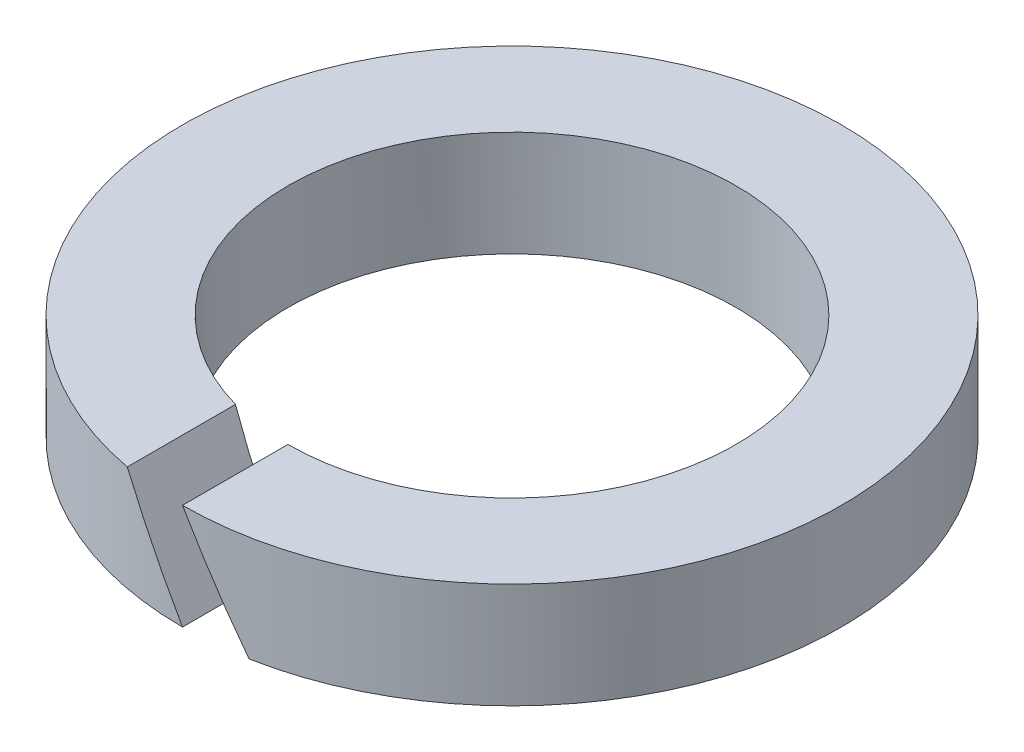
ISO-10303-21;
HEADER;
FILE_DESCRIPTION(('STEP AP214'),'2;1');
FILE_NAME('part.step','',(''),(''),'','','');
FILE_SCHEMA(('AUTOMOTIVE_DESIGN { 1 0 10303 214 1 1 1 1 }'));
ENDSEC;
DATA;
#1=APPLICATION_CONTEXT('core data for automotive mechanical design processes');
#2=APPLICATION_PROTOCOL_DEFINITION('international standard','automotive_design',2000,#1);
#3=PRODUCT_CONTEXT('',#1,'mechanical');
#4=PRODUCT('Part','Part','',(#3));
#5=PRODUCT_RELATED_PRODUCT_CATEGORY('part','',(#4));
#6=PRODUCT_DEFINITION_FORMATION('','',#4);
#7=PRODUCT_DEFINITION_CONTEXT('part definition',#1,'design');
#8=PRODUCT_DEFINITION('design','',#6,#7);
#9=PRODUCT_DEFINITION_SHAPE('','',#8);
#10=(LENGTH_UNIT() NAMED_UNIT(*) SI_UNIT(.MILLI.,.METRE.));
#11=(NAMED_UNIT(*) PLANE_ANGLE_UNIT() SI_UNIT($,.RADIAN.));
#12=(NAMED_UNIT(*) SI_UNIT($,.STERADIAN.) SOLID_ANGLE_UNIT());
#13=UNCERTAINTY_MEASURE_WITH_UNIT(LENGTH_MEASURE(1.E-05),#10,'distance_accuracy_value','');
#14=(GEOMETRIC_REPRESENTATION_CONTEXT(3) GLOBAL_UNCERTAINTY_ASSIGNED_CONTEXT((#13)) GLOBAL_UNIT_ASSIGNED_CONTEXT((#10,
#11,#12)) REPRESENTATION_CONTEXT('',''));
#15=CARTESIAN_POINT('',(0.,0.,0.));
#16=DIRECTION('',(0.,0.,1.));
#17=DIRECTION('',(1.,0.,0.));
#18=AXIS2_PLACEMENT_3D('',#15,#16,#17);
#19=CARTESIAN_POINT('',(0.,0.,0.));
#20=DIRECTION('',(0.,-1.,0.));
#21=DIRECTION('',(0.,0.,-1.));
#22=AXIS2_PLACEMENT_3D('',#19,#20,#21);
#23=CYLINDRICAL_SURFACE('',#22,1.7);
#24=CARTESIAN_POINT('',(0.,0.8,0.));
#25=DIRECTION('',(0.,-1.,0.));
#26=DIRECTION('',(0.,0.,-1.));
#27=AXIS2_PLACEMENT_3D('',#24,#25,#26);
#28=CIRCLE('',#27,1.7);
#29=CARTESIAN_POINT('',(-0.4618802153517,0.8,1.63605215890774));
#30=VERTEX_POINT('',#29);
#31=CARTESIAN_POINT('',(0.,0.800000000000001,1.7));
#32=VERTEX_POINT('',#31);
#33=EDGE_CURVE('E46',#30,#32,#28,.T.);
#34=ORIENTED_EDGE('',*,*,#33,.F.);
#35=CARTESIAN_POINT('',(0.,0.,0.));
#36=DIRECTION('',(0.866025403784439,0.5,0.));
#37=DIRECTION('',(0.5,-0.866025403784439,0.));
#38=AXIS2_PLACEMENT_3D('',#35,#36,#37);
#39=ELLIPSE('',#38,3.4,1.7);
#40=CARTESIAN_POINT('',(0.,0.,1.7));
#41=VERTEX_POINT('',#40);
#42=EDGE_CURVE('E103',#30,#41,#39,.T.);
#43=ORIENTED_EDGE('',*,*,#42,.T.);
#44=CARTESIAN_POINT('',(0.,0.,0.));
#45=DIRECTION('',(0.,-1.,0.));
#46=DIRECTION('',(0.,0.,-1.));
#47=AXIS2_PLACEMENT_3D('',#44,#45,#46);
#48=CIRCLE('',#47,1.7);
#49=CARTESIAN_POINT('',(0.4618802153517,0.,1.63605215890774));
#50=VERTEX_POINT('',#49);
#51=EDGE_CURVE('E98',#41,#50,#48,.T.);
#52=ORIENTED_EDGE('',*,*,#51,.T.);
#53=CARTESIAN_POINT('',(0.,0.8,0.));
#54=DIRECTION('',(-0.866025403784439,-0.499999999999999,0.));
#55=DIRECTION('',(0.499999999999999,-0.866025403784439,0.));
#56=AXIS2_PLACEMENT_3D('',#53,#54,#55);
#57=ELLIPSE('',#56,3.4,1.7);
#58=EDGE_CURVE('E53',#50,#32,#57,.T.);
#59=ORIENTED_EDGE('',*,*,#58,.T.);
#60=EDGE_LOOP('',(#34,#43,#52,#59));
#61=FACE_BOUND('',#60,.T.);
#62=ADVANCED_FACE('F39',(#61),#23,.F.);
#63=CARTESIAN_POINT('',(1.7,0.8,0.));
#64=DIRECTION('',(0.,1.,0.));
#65=DIRECTION('',(0.,0.,1.));
#66=AXIS2_PLACEMENT_3D('',#63,#64,#65);
#67=PLANE('',#66);
#68=CARTESIAN_POINT('',(0.,0.8,0.));
#69=DIRECTION('',(0.,-1.,0.));
#70=DIRECTION('',(0.,0.,-1.));
#71=AXIS2_PLACEMENT_3D('',#68,#69,#70);
#72=CIRCLE('',#71,2.5);
#73=CARTESIAN_POINT('',(-0.4618802153517,0.8,2.45696289484938));
#74=VERTEX_POINT('',#73);
#75=CARTESIAN_POINT('',(0.,0.800000000000001,2.5));
#76=VERTEX_POINT('',#75);
#77=EDGE_CURVE('E91',#74,#76,#72,.T.);
#78=ORIENTED_EDGE('',*,*,#77,.F.);
#79=DIRECTION('',(0.,0.,-1.));
#80=VECTOR('',#79,1.);
#81=CARTESIAN_POINT('',(-0.4618802153517,0.8,2.5));
#82=LINE('',#81,#80);
#83=EDGE_CURVE('E93',#74,#30,#82,.T.);
#84=ORIENTED_EDGE('',*,*,#83,.T.);
#85=ORIENTED_EDGE('',*,*,#33,.T.);
#86=DIRECTION('',(0.,0.,-1.));
#87=VECTOR('',#86,1.);
#88=CARTESIAN_POINT('',(0.,0.800000000000001,2.5));
#89=LINE('',#88,#87);
#90=EDGE_CURVE('E79',#76,#32,#89,.T.);
#91=ORIENTED_EDGE('',*,*,#90,.F.);
#92=EDGE_LOOP('',(#78,#84,#85,#91));
#93=FACE_BOUND('',#92,.T.);
#94=ADVANCED_FACE('F89',(#93),#67,.T.);
#95=CARTESIAN_POINT('',(0.,0.,0.));
#96=DIRECTION('',(0.,-1.,0.));
#97=DIRECTION('',(0.,0.,-1.));
#98=AXIS2_PLACEMENT_3D('',#95,#96,#97);
#99=CYLINDRICAL_SURFACE('',#98,2.5);
#100=CARTESIAN_POINT('',(0.,0.,0.));
#101=DIRECTION('',(0.,-1.,0.));
#102=DIRECTION('',(0.,0.,-1.));
#103=AXIS2_PLACEMENT_3D('',#100,#101,#102);
#104=CIRCLE('',#103,2.5);
#105=CARTESIAN_POINT('',(0.,0.,2.5));
#106=VERTEX_POINT('',#105);
#107=CARTESIAN_POINT('',(0.4618802153517,0.,2.45696289484939));
#108=VERTEX_POINT('',#107);
#109=EDGE_CURVE('E96',#106,#108,#104,.T.);
#110=ORIENTED_EDGE('',*,*,#109,.F.);
#111=CARTESIAN_POINT('',(0.,0.,0.));
#112=DIRECTION('',(0.866025403784439,0.5,0.));
#113=DIRECTION('',(0.5,-0.866025403784439,0.));
#114=AXIS2_PLACEMENT_3D('',#111,#112,#113);
#115=ELLIPSE('',#114,5.,2.5);
#116=EDGE_CURVE('E60',#106,#74,#115,.F.);
#117=ORIENTED_EDGE('',*,*,#116,.T.);
#118=ORIENTED_EDGE('',*,*,#77,.T.);
#119=CARTESIAN_POINT('',(0.,0.8,0.));
#120=DIRECTION('',(-0.866025403784439,-0.499999999999999,0.));
#121=DIRECTION('',(0.499999999999999,-0.866025403784439,0.));
#122=AXIS2_PLACEMENT_3D('',#119,#120,#121);
#123=ELLIPSE('',#122,5.00000000000001,2.5);
#124=EDGE_CURVE('E76',#76,#108,#123,.F.);
#125=ORIENTED_EDGE('',*,*,#124,.T.);
#126=EDGE_LOOP('',(#110,#117,#118,#125));
#127=FACE_BOUND('',#126,.T.);
#128=ADVANCED_FACE('F95',(#127),#99,.T.);
#129=CARTESIAN_POINT('',(1.7,0.,0.));
#130=DIRECTION('',(0.,-1.,0.));
#131=DIRECTION('',(0.,0.,-1.));
#132=AXIS2_PLACEMENT_3D('',#129,#130,#131);
#133=PLANE('',#132);
#134=ORIENTED_EDGE('',*,*,#51,.F.);
#135=DIRECTION('',(0.,0.,-1.));
#136=VECTOR('',#135,1.);
#137=CARTESIAN_POINT('',(0.,0.,2.5));
#138=LINE('',#137,#136);
#139=EDGE_CURVE('E84',#106,#41,#138,.T.);
#140=ORIENTED_EDGE('',*,*,#139,.F.);
#141=ORIENTED_EDGE('',*,*,#109,.T.);
#142=DIRECTION('',(0.,0.,-1.));
#143=VECTOR('',#142,1.);
#144=CARTESIAN_POINT('',(0.4618802153517,0.,0.));
#145=LINE('',#144,#143);
#146=EDGE_CURVE('E11',#108,#50,#145,.T.);
#147=ORIENTED_EDGE('',*,*,#146,.T.);
#148=EDGE_LOOP('',(#134,#140,#141,#147));
#149=FACE_BOUND('',#148,.T.);
#150=ADVANCED_FACE('F112',(#149),#133,.T.);
#151=CARTESIAN_POINT('',(0.4618802153517,0.,2.5));
#152=DIRECTION('',(-0.866025403784439,-0.499999999999999,0.));
#153=DIRECTION('',(0.499999999999999,-0.866025403784439,0.));
#154=AXIS2_PLACEMENT_3D('',#151,#152,#153);
#155=PLANE('',#154);
#156=ORIENTED_EDGE('',*,*,#146,.F.);
#157=ORIENTED_EDGE('',*,*,#124,.F.);
#158=ORIENTED_EDGE('',*,*,#90,.T.);
#159=ORIENTED_EDGE('',*,*,#58,.F.);
#160=EDGE_LOOP('',(#156,#157,#158,#159));
#161=FACE_BOUND('',#160,.T.);
#162=ADVANCED_FACE('F78',(#161),#155,.T.);
#163=CARTESIAN_POINT('',(-0.4618802153517,0.8,2.5));
#164=DIRECTION('',(0.866025403784439,0.5,0.));
#165=DIRECTION('',(-0.5,0.866025403784439,0.));
#166=AXIS2_PLACEMENT_3D('',#163,#164,#165);
#167=PLANE('',#166);
#168=ORIENTED_EDGE('',*,*,#83,.F.);
#169=ORIENTED_EDGE('',*,*,#116,.F.);
#170=ORIENTED_EDGE('',*,*,#139,.T.);
#171=ORIENTED_EDGE('',*,*,#42,.F.);
#172=EDGE_LOOP('',(#168,#169,#170,#171));
#173=FACE_BOUND('',#172,.T.);
#174=ADVANCED_FACE('F113',(#173),#167,.T.);
#175=CLOSED_SHELL('',(#62,#94,#128,#150,#162,#174));
#176=MANIFOLD_SOLID_BREP('B2',#175);
#177=ADVANCED_BREP_SHAPE_REPRESENTATION('',(#18,#176),#14);
#178=SHAPE_DEFINITION_REPRESENTATION(#9,#177);
ENDSEC;
END-ISO-10303-21;
